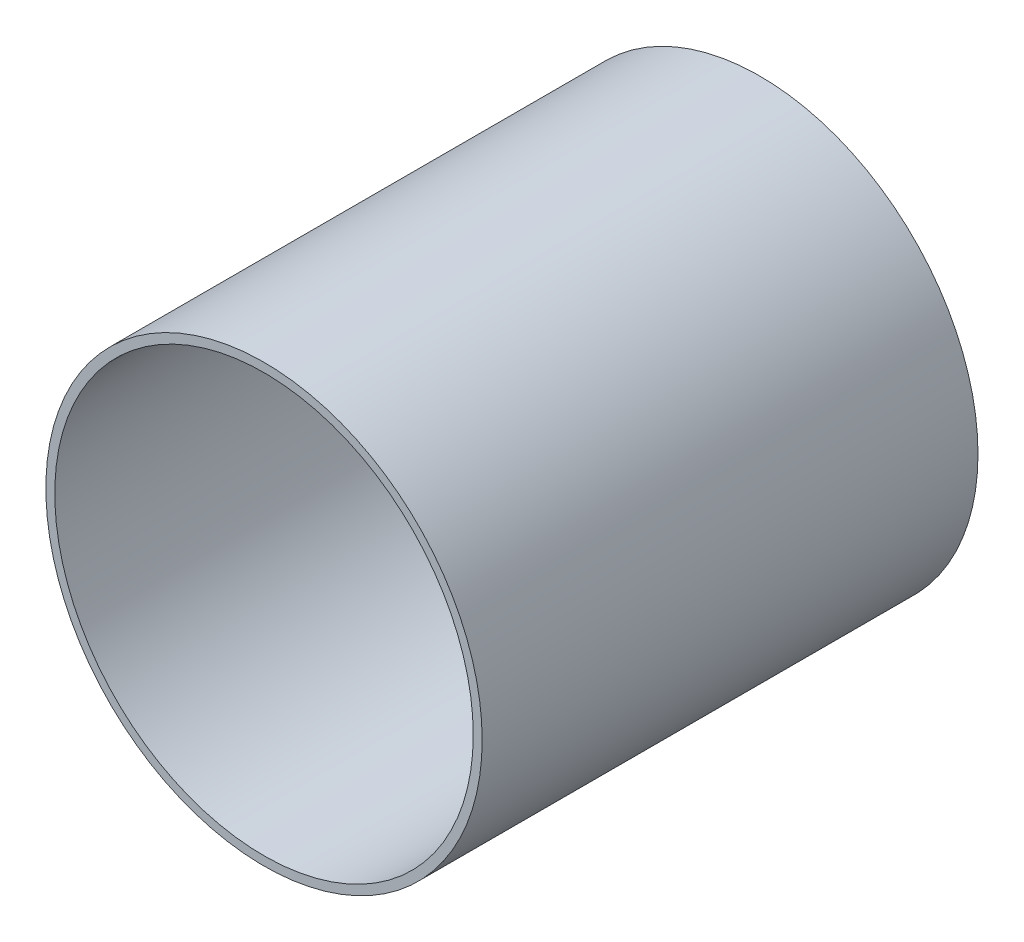
ISO-10303-21;
HEADER;
FILE_DESCRIPTION(('STEP AP214'),'2;1');
FILE_NAME('part.step','',(''),(''),'','','');
FILE_SCHEMA(('AUTOMOTIVE_DESIGN { 1 0 10303 214 1 1 1 1 }'));
ENDSEC;
DATA;
#1=APPLICATION_CONTEXT('core data for automotive mechanical design processes');
#2=APPLICATION_PROTOCOL_DEFINITION('international standard','automotive_design',2000,#1);
#3=PRODUCT_CONTEXT('',#1,'mechanical');
#4=PRODUCT('Part','Part','',(#3));
#5=PRODUCT_RELATED_PRODUCT_CATEGORY('part','',(#4));
#6=PRODUCT_DEFINITION_FORMATION('','',#4);
#7=PRODUCT_DEFINITION_CONTEXT('part definition',#1,'design');
#8=PRODUCT_DEFINITION('design','',#6,#7);
#9=PRODUCT_DEFINITION_SHAPE('','',#8);
#10=(LENGTH_UNIT() NAMED_UNIT(*) SI_UNIT(.MILLI.,.METRE.));
#11=(NAMED_UNIT(*) PLANE_ANGLE_UNIT() SI_UNIT($,.RADIAN.));
#12=(NAMED_UNIT(*) SI_UNIT($,.STERADIAN.) SOLID_ANGLE_UNIT());
#13=UNCERTAINTY_MEASURE_WITH_UNIT(LENGTH_MEASURE(1.E-05),#10,'distance_accuracy_value','');
#14=(GEOMETRIC_REPRESENTATION_CONTEXT(3) GLOBAL_UNCERTAINTY_ASSIGNED_CONTEXT((#13)) GLOBAL_UNIT_ASSIGNED_CONTEXT((#10,
#11,#12)) REPRESENTATION_CONTEXT('',''));
#15=CARTESIAN_POINT('',(0.,0.,0.));
#16=DIRECTION('',(0.,0.,1.));
#17=DIRECTION('',(1.,0.,0.));
#18=AXIS2_PLACEMENT_3D('',#15,#16,#17);
#19=CARTESIAN_POINT('',(0.,0.,25.));
#20=DIRECTION('',(0.,0.,1.));
#21=DIRECTION('',(1.,0.,0.));
#22=AXIS2_PLACEMENT_3D('',#19,#20,#21);
#23=PLANE('',#22);
#24=CARTESIAN_POINT('',(0.,0.,25.));
#25=DIRECTION('',(0.,0.,1.));
#26=DIRECTION('',(1.,0.,0.));
#27=AXIS2_PLACEMENT_3D('',#24,#25,#26);
#28=CIRCLE('',#27,11.);
#29=CARTESIAN_POINT('',(11.,0.,25.));
#30=VERTEX_POINT('',#29);
#31=EDGE_CURVE('E10',#30,#30,#28,.T.);
#32=ORIENTED_EDGE('',*,*,#31,.T.);
#33=EDGE_LOOP('',(#32));
#34=FACE_BOUND('',#33,.T.);
#35=CARTESIAN_POINT('',(0.,0.,25.));
#36=DIRECTION('',(0.,0.,1.));
#37=DIRECTION('',(1.,0.,0.));
#38=AXIS2_PLACEMENT_3D('',#35,#36,#37);
#39=CIRCLE('',#38,10.55);
#40=CARTESIAN_POINT('',(10.55,0.,25.));
#41=VERTEX_POINT('',#40);
#42=EDGE_CURVE('E42',#41,#41,#39,.T.);
#43=ORIENTED_EDGE('',*,*,#42,.F.);
#44=EDGE_LOOP('',(#43));
#45=FACE_BOUND('',#44,.T.);
#46=ADVANCED_FACE('F31',(#34,#45),#23,.T.);
#47=CARTESIAN_POINT('',(0.,0.,0.));
#48=DIRECTION('',(0.,0.,1.));
#49=DIRECTION('',(1.,0.,0.));
#50=AXIS2_PLACEMENT_3D('',#47,#48,#49);
#51=PLANE('',#50);
#52=CARTESIAN_POINT('',(0.,0.,0.));
#53=DIRECTION('',(0.,0.,1.));
#54=DIRECTION('',(1.,0.,0.));
#55=AXIS2_PLACEMENT_3D('',#52,#53,#54);
#56=CIRCLE('',#55,11.);
#57=CARTESIAN_POINT('',(11.,0.,0.));
#58=VERTEX_POINT('',#57);
#59=EDGE_CURVE('E35',#58,#58,#56,.T.);
#60=ORIENTED_EDGE('',*,*,#59,.F.);
#61=EDGE_LOOP('',(#60));
#62=FACE_BOUND('',#61,.T.);
#63=CARTESIAN_POINT('',(0.,0.,0.));
#64=DIRECTION('',(0.,0.,1.));
#65=DIRECTION('',(1.,0.,0.));
#66=AXIS2_PLACEMENT_3D('',#63,#64,#65);
#67=CIRCLE('',#66,10.55);
#68=CARTESIAN_POINT('',(10.55,0.,0.));
#69=VERTEX_POINT('',#68);
#70=EDGE_CURVE('E44',#69,#69,#67,.T.);
#71=ORIENTED_EDGE('',*,*,#70,.T.);
#72=EDGE_LOOP('',(#71));
#73=FACE_BOUND('',#72,.T.);
#74=ADVANCED_FACE('F54',(#62,#73),#51,.F.);
#75=CARTESIAN_POINT('',(0.,0.,25.));
#76=DIRECTION('',(0.,0.,-1.));
#77=DIRECTION('',(-1.,0.,0.));
#78=AXIS2_PLACEMENT_3D('',#75,#76,#77);
#79=CYLINDRICAL_SURFACE('',#78,11.);
#80=ORIENTED_EDGE('',*,*,#31,.F.);
#81=EDGE_LOOP('',(#80));
#82=FACE_BOUND('',#81,.T.);
#83=ORIENTED_EDGE('',*,*,#59,.T.);
#84=EDGE_LOOP('',(#83));
#85=FACE_BOUND('',#84,.T.);
#86=ADVANCED_FACE('F33',(#82,#85),#79,.T.);
#87=CARTESIAN_POINT('',(0.,0.,25.));
#88=DIRECTION('',(0.,0.,-1.));
#89=DIRECTION('',(-1.,0.,0.));
#90=AXIS2_PLACEMENT_3D('',#87,#88,#89);
#91=CYLINDRICAL_SURFACE('',#90,10.55);
#92=ORIENTED_EDGE('',*,*,#42,.T.);
#93=EDGE_LOOP('',(#92));
#94=FACE_BOUND('',#93,.T.);
#95=ORIENTED_EDGE('',*,*,#70,.F.);
#96=EDGE_LOOP('',(#95));
#97=FACE_BOUND('',#96,.T.);
#98=ADVANCED_FACE('F50',(#94,#97),#91,.F.);
#99=CLOSED_SHELL('',(#46,#74,#86,#98));
#100=MANIFOLD_SOLID_BREP('B2',#99);
#101=ADVANCED_BREP_SHAPE_REPRESENTATION('',(#18,#100),#14);
#102=SHAPE_DEFINITION_REPRESENTATION(#9,#101);
ENDSEC;
END-ISO-10303-21;
